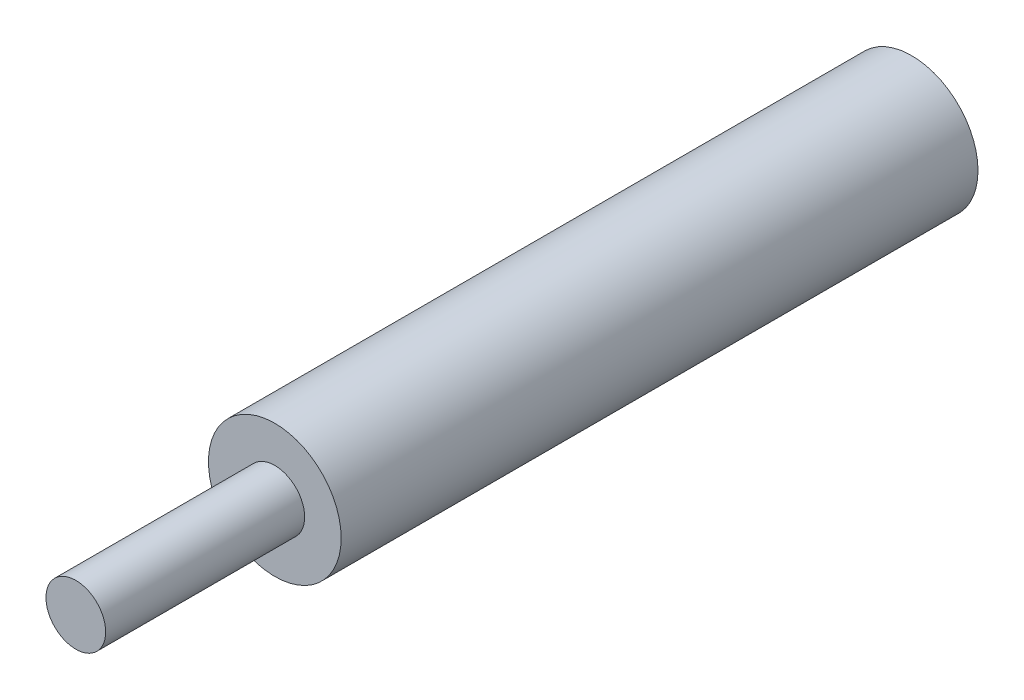
ISO-10303-21;
HEADER;
FILE_DESCRIPTION(('STEP AP214'),'2;1');
FILE_NAME('part.step','',(''),(''),'','','');
FILE_SCHEMA(('AUTOMOTIVE_DESIGN { 1 0 10303 214 1 1 1 1 }'));
ENDSEC;
DATA;
#1=APPLICATION_CONTEXT('core data for automotive mechanical design processes');
#2=APPLICATION_PROTOCOL_DEFINITION('international standard','automotive_design',2000,#1);
#3=PRODUCT_CONTEXT('',#1,'mechanical');
#4=PRODUCT('Part','Part','',(#3));
#5=PRODUCT_RELATED_PRODUCT_CATEGORY('part','',(#4));
#6=PRODUCT_DEFINITION_FORMATION('','',#4);
#7=PRODUCT_DEFINITION_CONTEXT('part definition',#1,'design');
#8=PRODUCT_DEFINITION('design','',#6,#7);
#9=PRODUCT_DEFINITION_SHAPE('','',#8);
#10=(LENGTH_UNIT() NAMED_UNIT(*) SI_UNIT(.MILLI.,.METRE.));
#11=(NAMED_UNIT(*) PLANE_ANGLE_UNIT() SI_UNIT($,.RADIAN.));
#12=(NAMED_UNIT(*) SI_UNIT($,.STERADIAN.) SOLID_ANGLE_UNIT());
#13=UNCERTAINTY_MEASURE_WITH_UNIT(LENGTH_MEASURE(1.E-05),#10,'distance_accuracy_value','');
#14=(GEOMETRIC_REPRESENTATION_CONTEXT(3) GLOBAL_UNCERTAINTY_ASSIGNED_CONTEXT((#13)) GLOBAL_UNIT_ASSIGNED_CONTEXT((#10,
#11,#12)) REPRESENTATION_CONTEXT('',''));
#15=CARTESIAN_POINT('',(0.,0.,0.));
#16=DIRECTION('',(0.,0.,1.));
#17=DIRECTION('',(1.,0.,0.));
#18=AXIS2_PLACEMENT_3D('',#15,#16,#17);
#19=CARTESIAN_POINT('',(0.,0.,80.));
#20=DIRECTION('',(0.,0.,-1.));
#21=DIRECTION('',(-1.,0.,0.));
#22=AXIS2_PLACEMENT_3D('',#19,#20,#21);
#23=CYLINDRICAL_SURFACE('',#22,16.675);
#24=CARTESIAN_POINT('',(0.,0.,80.));
#25=DIRECTION('',(0.,0.,1.));
#26=DIRECTION('',(1.,0.,0.));
#27=AXIS2_PLACEMENT_3D('',#24,#25,#26);
#28=CIRCLE('',#27,16.675);
#29=CARTESIAN_POINT('',(16.675,0.,80.));
#30=VERTEX_POINT('',#29);
#31=EDGE_CURVE('E49',#30,#30,#28,.T.);
#32=ORIENTED_EDGE('',*,*,#31,.F.);
#33=EDGE_LOOP('',(#32));
#34=FACE_BOUND('',#33,.T.);
#35=CARTESIAN_POINT('',(0.,0.,-80.));
#36=DIRECTION('',(0.,0.,1.));
#37=DIRECTION('',(1.,0.,0.));
#38=AXIS2_PLACEMENT_3D('',#35,#36,#37);
#39=CIRCLE('',#38,16.675);
#40=CARTESIAN_POINT('',(16.675,0.,-80.));
#41=VERTEX_POINT('',#40);
#42=EDGE_CURVE('E45',#41,#41,#39,.T.);
#43=ORIENTED_EDGE('',*,*,#42,.T.);
#44=EDGE_LOOP('',(#43));
#45=FACE_BOUND('',#44,.T.);
#46=ADVANCED_FACE('F42',(#34,#45),#23,.T.);
#47=CARTESIAN_POINT('',(0.,0.,80.));
#48=DIRECTION('',(0.,0.,1.));
#49=DIRECTION('',(1.,0.,0.));
#50=AXIS2_PLACEMENT_3D('',#47,#48,#49);
#51=PLANE('',#50);
#52=CARTESIAN_POINT('',(0.,0.,80.));
#53=DIRECTION('',(0.,0.,1.));
#54=DIRECTION('',(1.,0.,0.));
#55=AXIS2_PLACEMENT_3D('',#52,#53,#54);
#56=CIRCLE('',#55,7.5);
#57=CARTESIAN_POINT('',(7.5,0.,80.));
#58=VERTEX_POINT('',#57);
#59=EDGE_CURVE('E10',#58,#58,#56,.T.);
#60=ORIENTED_EDGE('',*,*,#59,.F.);
#61=EDGE_LOOP('',(#60));
#62=FACE_BOUND('',#61,.T.);
#63=ORIENTED_EDGE('',*,*,#31,.T.);
#64=EDGE_LOOP('',(#63));
#65=FACE_BOUND('',#64,.T.);
#66=ADVANCED_FACE('F66',(#62,#65),#51,.T.);
#67=CARTESIAN_POINT('',(0.,0.,-80.));
#68=DIRECTION('',(0.,0.,1.));
#69=DIRECTION('',(1.,0.,0.));
#70=AXIS2_PLACEMENT_3D('',#67,#68,#69);
#71=PLANE('',#70);
#72=ORIENTED_EDGE('',*,*,#42,.F.);
#73=EDGE_LOOP('',(#72));
#74=FACE_BOUND('',#73,.T.);
#75=ADVANCED_FACE('F63',(#74),#71,.F.);
#76=CARTESIAN_POINT('',(0.,0.,130.));
#77=DIRECTION('',(0.,0.,-1.));
#78=DIRECTION('',(-1.,0.,0.));
#79=AXIS2_PLACEMENT_3D('',#76,#77,#78);
#80=CYLINDRICAL_SURFACE('',#79,7.5);
#81=CARTESIAN_POINT('',(0.,0.,130.));
#82=DIRECTION('',(0.,0.,1.));
#83=DIRECTION('',(1.,0.,0.));
#84=AXIS2_PLACEMENT_3D('',#81,#82,#83);
#85=CIRCLE('',#84,7.5);
#86=CARTESIAN_POINT('',(7.5,0.,130.));
#87=VERTEX_POINT('',#86);
#88=EDGE_CURVE('E55',#87,#87,#85,.T.);
#89=ORIENTED_EDGE('',*,*,#88,.F.);
#90=EDGE_LOOP('',(#89));
#91=FACE_BOUND('',#90,.T.);
#92=ORIENTED_EDGE('',*,*,#59,.T.);
#93=EDGE_LOOP('',(#92));
#94=FACE_BOUND('',#93,.T.);
#95=ADVANCED_FACE('F65',(#91,#94),#80,.T.);
#96=CARTESIAN_POINT('',(0.,0.,130.));
#97=DIRECTION('',(0.,0.,1.));
#98=DIRECTION('',(1.,0.,0.));
#99=AXIS2_PLACEMENT_3D('',#96,#97,#98);
#100=PLANE('',#99);
#101=ORIENTED_EDGE('',*,*,#88,.T.);
#102=EDGE_LOOP('',(#101));
#103=FACE_BOUND('',#102,.T.);
#104=ADVANCED_FACE('F71',(#103),#100,.T.);
#105=CLOSED_SHELL('',(#46,#66,#75,#95,#104));
#106=MANIFOLD_SOLID_BREP('B2',#105);
#107=ADVANCED_BREP_SHAPE_REPRESENTATION('',(#18,#106),#14);
#108=SHAPE_DEFINITION_REPRESENTATION(#9,#107);
ENDSEC;
END-ISO-10303-21;
